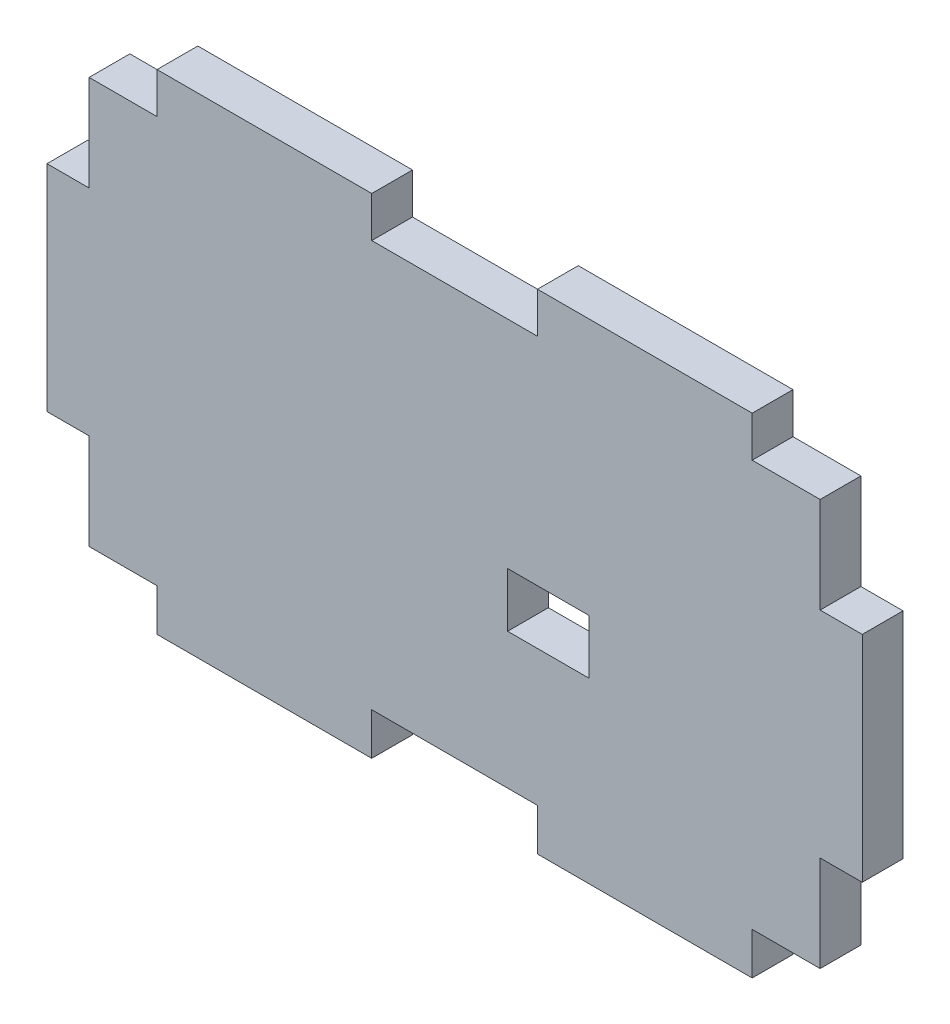
ISO-10303-21;
HEADER;
FILE_DESCRIPTION(('STEP AP214'),'2;1');
FILE_NAME('part.step','',(''),(''),'','','');
FILE_SCHEMA(('AUTOMOTIVE_DESIGN { 1 0 10303 214 1 1 1 1 }'));
ENDSEC;
DATA;
#1=APPLICATION_CONTEXT('core data for automotive mechanical design processes');
#2=APPLICATION_PROTOCOL_DEFINITION('international standard','automotive_design',2000,#1);
#3=PRODUCT_CONTEXT('',#1,'mechanical');
#4=PRODUCT('Part','Part','',(#3));
#5=PRODUCT_RELATED_PRODUCT_CATEGORY('part','',(#4));
#6=PRODUCT_DEFINITION_FORMATION('','',#4);
#7=PRODUCT_DEFINITION_CONTEXT('part definition',#1,'design');
#8=PRODUCT_DEFINITION('design','',#6,#7);
#9=PRODUCT_DEFINITION_SHAPE('','',#8);
#10=(LENGTH_UNIT() NAMED_UNIT(*) SI_UNIT(.MILLI.,.METRE.));
#11=(NAMED_UNIT(*) PLANE_ANGLE_UNIT() SI_UNIT($,.RADIAN.));
#12=(NAMED_UNIT(*) SI_UNIT($,.STERADIAN.) SOLID_ANGLE_UNIT());
#13=UNCERTAINTY_MEASURE_WITH_UNIT(LENGTH_MEASURE(1.E-05),#10,'distance_accuracy_value','');
#14=(GEOMETRIC_REPRESENTATION_CONTEXT(3) GLOBAL_UNCERTAINTY_ASSIGNED_CONTEXT((#13)) GLOBAL_UNIT_ASSIGNED_CONTEXT((#10,
#11,#12)) REPRESENTATION_CONTEXT('',''));
#15=CARTESIAN_POINT('',(0.,0.,0.));
#16=DIRECTION('',(0.,0.,1.));
#17=DIRECTION('',(1.,0.,0.));
#18=AXIS2_PLACEMENT_3D('',#15,#16,#17);
#19=CARTESIAN_POINT('',(0.,14.,3.));
#20=DIRECTION('',(0.,1.,0.));
#21=DIRECTION('',(-1.,0.,0.));
#22=AXIS2_PLACEMENT_3D('',#19,#20,#21);
#23=PLANE('',#22);
#24=DIRECTION('',(1.,0.,0.));
#25=VECTOR('',#24,1.);
#26=CARTESIAN_POINT('',(0.,14.,0.));
#27=LINE('',#26,#25);
#28=CARTESIAN_POINT('',(30.8,14.,0.));
#29=VERTEX_POINT('',#28);
#30=CARTESIAN_POINT('',(36.8,14.,0.));
#31=VERTEX_POINT('',#30);
#32=EDGE_CURVE('E361',#29,#31,#27,.T.);
#33=ORIENTED_EDGE('',*,*,#32,.T.);
#34=DIRECTION('',(0.,0.,-1.));
#35=VECTOR('',#34,1.);
#36=CARTESIAN_POINT('',(36.8,14.,3.));
#37=LINE('',#36,#35);
#38=CARTESIAN_POINT('',(36.8,14.,3.));
#39=VERTEX_POINT('',#38);
#40=EDGE_CURVE('E11',#39,#31,#37,.T.);
#41=ORIENTED_EDGE('',*,*,#40,.F.);
#42=DIRECTION('',(1.,0.,0.));
#43=VECTOR('',#42,1.);
#44=CARTESIAN_POINT('',(0.,14.,3.));
#45=LINE('',#44,#43);
#46=CARTESIAN_POINT('',(30.8,14.,3.));
#47=VERTEX_POINT('',#46);
#48=EDGE_CURVE('E260',#47,#39,#45,.T.);
#49=ORIENTED_EDGE('',*,*,#48,.F.);
#50=DIRECTION('',(0.,0.,-1.));
#51=VECTOR('',#50,1.);
#52=CARTESIAN_POINT('',(30.8,14.,3.));
#53=LINE('',#52,#51);
#54=EDGE_CURVE('E56',#47,#29,#53,.T.);
#55=ORIENTED_EDGE('',*,*,#54,.T.);
#56=EDGE_LOOP('',(#33,#41,#49,#55));
#57=FACE_BOUND('',#56,.T.);
#58=ADVANCED_FACE('F37',(#57),#23,.F.);
#59=CARTESIAN_POINT('',(36.8,0.,3.));
#60=DIRECTION('',(1.,0.,0.));
#61=DIRECTION('',(0.,1.,0.));
#62=AXIS2_PLACEMENT_3D('',#59,#60,#61);
#63=PLANE('',#62);
#64=DIRECTION('',(0.,-1.,0.));
#65=VECTOR('',#64,1.);
#66=CARTESIAN_POINT('',(36.8,0.,0.));
#67=LINE('',#66,#65);
#68=CARTESIAN_POINT('',(36.8,10.,0.));
#69=VERTEX_POINT('',#68);
#70=EDGE_CURVE('E266',#31,#69,#67,.T.);
#71=ORIENTED_EDGE('',*,*,#70,.T.);
#72=DIRECTION('',(0.,0.,-1.));
#73=VECTOR('',#72,1.);
#74=CARTESIAN_POINT('',(36.8,10.,3.));
#75=LINE('',#74,#73);
#76=CARTESIAN_POINT('',(36.8,10.,3.));
#77=VERTEX_POINT('',#76);
#78=EDGE_CURVE('E47',#77,#69,#75,.T.);
#79=ORIENTED_EDGE('',*,*,#78,.F.);
#80=DIRECTION('',(0.,-1.,0.));
#81=VECTOR('',#80,1.);
#82=CARTESIAN_POINT('',(36.8,0.,3.));
#83=LINE('',#82,#81);
#84=EDGE_CURVE('E254',#39,#77,#83,.T.);
#85=ORIENTED_EDGE('',*,*,#84,.F.);
#86=ORIENTED_EDGE('',*,*,#40,.T.);
#87=EDGE_LOOP('',(#71,#79,#85,#86));
#88=FACE_BOUND('',#87,.T.);
#89=ADVANCED_FACE('F265',(#88),#63,.F.);
#90=CARTESIAN_POINT('',(0.,10.,3.));
#91=DIRECTION('',(0.,1.,0.));
#92=DIRECTION('',(0.,0.,1.));
#93=AXIS2_PLACEMENT_3D('',#90,#91,#92);
#94=PLANE('',#93);
#95=DIRECTION('',(1.,0.,0.));
#96=VECTOR('',#95,1.);
#97=CARTESIAN_POINT('',(0.,10.,0.));
#98=LINE('',#97,#96);
#99=CARTESIAN_POINT('',(30.8,10.,0.));
#100=VERTEX_POINT('',#99);
#101=EDGE_CURVE('E364',#100,#69,#98,.T.);
#102=ORIENTED_EDGE('',*,*,#101,.F.);
#103=DIRECTION('',(0.,0.,-1.));
#104=VECTOR('',#103,1.);
#105=CARTESIAN_POINT('',(30.8,10.,3.));
#106=LINE('',#105,#104);
#107=CARTESIAN_POINT('',(30.8,10.,3.));
#108=VERTEX_POINT('',#107);
#109=EDGE_CURVE('E154',#108,#100,#106,.T.);
#110=ORIENTED_EDGE('',*,*,#109,.F.);
#111=DIRECTION('',(1.,0.,0.));
#112=VECTOR('',#111,1.);
#113=CARTESIAN_POINT('',(0.,10.,3.));
#114=LINE('',#113,#112);
#115=EDGE_CURVE('E259',#108,#77,#114,.T.);
#116=ORIENTED_EDGE('',*,*,#115,.T.);
#117=ORIENTED_EDGE('',*,*,#78,.T.);
#118=EDGE_LOOP('',(#102,#110,#116,#117));
#119=FACE_BOUND('',#118,.T.);
#120=ADVANCED_FACE('F270',(#119),#94,.T.);
#121=CARTESIAN_POINT('',(0.,0.,3.));
#122=DIRECTION('',(-1.,0.,0.));
#123=DIRECTION('',(0.,0.,1.));
#124=AXIS2_PLACEMENT_3D('',#121,#122,#123);
#125=PLANE('',#124);
#126=DIRECTION('',(0.,1.,0.));
#127=VECTOR('',#126,1.);
#128=CARTESIAN_POINT('',(0.,0.,0.));
#129=LINE('',#128,#127);
#130=CARTESIAN_POINT('',(0.,22.85,0.));
#131=VERTEX_POINT('',#130);
#132=CARTESIAN_POINT('',(0.,29.9,0.));
#133=VERTEX_POINT('',#132);
#134=EDGE_CURVE('E277',#131,#133,#129,.T.);
#135=ORIENTED_EDGE('',*,*,#134,.F.);
#136=DIRECTION('',(0.,0.,-1.));
#137=VECTOR('',#136,1.);
#138=CARTESIAN_POINT('',(0.,22.85,3.));
#139=LINE('',#138,#137);
#140=CARTESIAN_POINT('',(0.,22.85,3.));
#141=VERTEX_POINT('',#140);
#142=EDGE_CURVE('E41',#141,#131,#139,.T.);
#143=ORIENTED_EDGE('',*,*,#142,.F.);
#144=DIRECTION('',(0.,1.,0.));
#145=VECTOR('',#144,1.);
#146=CARTESIAN_POINT('',(0.,0.,3.));
#147=LINE('',#146,#145);
#148=CARTESIAN_POINT('',(0.,29.9,3.));
#149=VERTEX_POINT('',#148);
#150=EDGE_CURVE('E369',#141,#149,#147,.T.);
#151=ORIENTED_EDGE('',*,*,#150,.T.);
#152=DIRECTION('',(0.,0.,-1.));
#153=VECTOR('',#152,1.);
#154=CARTESIAN_POINT('',(0.,29.9,3.));
#155=LINE('',#154,#153);
#156=EDGE_CURVE('E273',#149,#133,#155,.T.);
#157=ORIENTED_EDGE('',*,*,#156,.T.);
#158=EDGE_LOOP('',(#135,#143,#151,#157));
#159=FACE_BOUND('',#158,.T.);
#160=ADVANCED_FACE('F39',(#159),#125,.T.);
#161=CARTESIAN_POINT('',(0.,22.85,3.));
#162=DIRECTION('',(0.,1.,0.));
#163=DIRECTION('',(0.,0.,1.));
#164=AXIS2_PLACEMENT_3D('',#161,#162,#163);
#165=PLANE('',#164);
#166=DIRECTION('',(1.,0.,0.));
#167=VECTOR('',#166,1.);
#168=CARTESIAN_POINT('',(0.,22.85,0.));
#169=LINE('',#168,#167);
#170=CARTESIAN_POINT('',(-3.1,22.85,0.));
#171=VERTEX_POINT('',#170);
#172=EDGE_CURVE('E280',#171,#131,#169,.T.);
#173=ORIENTED_EDGE('',*,*,#172,.F.);
#174=DIRECTION('',(0.,0.,-1.));
#175=VECTOR('',#174,1.);
#176=CARTESIAN_POINT('',(-3.1,22.85,3.));
#177=LINE('',#176,#175);
#178=CARTESIAN_POINT('',(-3.1,22.85,3.));
#179=VERTEX_POINT('',#178);
#180=EDGE_CURVE('E422',#179,#171,#177,.T.);
#181=ORIENTED_EDGE('',*,*,#180,.F.);
#182=DIRECTION('',(1.,0.,0.));
#183=VECTOR('',#182,1.);
#184=CARTESIAN_POINT('',(0.,22.85,3.));
#185=LINE('',#184,#183);
#186=EDGE_CURVE('E431',#179,#141,#185,.T.);
#187=ORIENTED_EDGE('',*,*,#186,.T.);
#188=ORIENTED_EDGE('',*,*,#142,.T.);
#189=EDGE_LOOP('',(#173,#181,#187,#188));
#190=FACE_BOUND('',#189,.T.);
#191=ADVANCED_FACE('F429',(#190),#165,.T.);
#192=CARTESIAN_POINT('',(-3.1,0.,3.));
#193=DIRECTION('',(-1.,0.,0.));
#194=DIRECTION('',(0.,0.,1.));
#195=AXIS2_PLACEMENT_3D('',#192,#193,#194);
#196=PLANE('',#195);
#197=DIRECTION('',(0.,1.,0.));
#198=VECTOR('',#197,1.);
#199=CARTESIAN_POINT('',(-3.1,0.,0.));
#200=LINE('',#199,#198);
#201=CARTESIAN_POINT('',(-3.1,7.05,0.));
#202=VERTEX_POINT('',#201);
#203=EDGE_CURVE('E283',#202,#171,#200,.T.);
#204=ORIENTED_EDGE('',*,*,#203,.F.);
#205=DIRECTION('',(0.,0.,-1.));
#206=VECTOR('',#205,1.);
#207=CARTESIAN_POINT('',(-3.1,7.05,3.));
#208=LINE('',#207,#206);
#209=CARTESIAN_POINT('',(-3.1,7.05,3.));
#210=VERTEX_POINT('',#209);
#211=EDGE_CURVE('E421',#210,#202,#208,.T.);
#212=ORIENTED_EDGE('',*,*,#211,.F.);
#213=DIRECTION('',(0.,1.,0.));
#214=VECTOR('',#213,1.);
#215=CARTESIAN_POINT('',(-3.1,0.,3.));
#216=LINE('',#215,#214);
#217=EDGE_CURVE('E439',#210,#179,#216,.T.);
#218=ORIENTED_EDGE('',*,*,#217,.T.);
#219=ORIENTED_EDGE('',*,*,#180,.T.);
#220=EDGE_LOOP('',(#204,#212,#218,#219));
#221=FACE_BOUND('',#220,.T.);
#222=ADVANCED_FACE('F437',(#221),#196,.T.);
#223=CARTESIAN_POINT('',(0.,7.05,3.));
#224=DIRECTION('',(0.,-1.,0.));
#225=DIRECTION('',(0.,0.,-1.));
#226=AXIS2_PLACEMENT_3D('',#223,#224,#225);
#227=PLANE('',#226);
#228=DIRECTION('',(-1.,0.,0.));
#229=VECTOR('',#228,1.);
#230=CARTESIAN_POINT('',(0.,7.05,0.));
#231=LINE('',#230,#229);
#232=CARTESIAN_POINT('',(0.,7.05,0.));
#233=VERTEX_POINT('',#232);
#234=EDGE_CURVE('E286',#233,#202,#231,.T.);
#235=ORIENTED_EDGE('',*,*,#234,.F.);
#236=DIRECTION('',(0.,0.,-1.));
#237=VECTOR('',#236,1.);
#238=CARTESIAN_POINT('',(0.,7.05,3.));
#239=LINE('',#238,#237);
#240=CARTESIAN_POINT('',(0.,7.05,3.));
#241=VERTEX_POINT('',#240);
#242=EDGE_CURVE('E419',#241,#233,#239,.T.);
#243=ORIENTED_EDGE('',*,*,#242,.F.);
#244=DIRECTION('',(-1.,0.,0.));
#245=VECTOR('',#244,1.);
#246=CARTESIAN_POINT('',(0.,7.05,3.));
#247=LINE('',#246,#245);
#248=EDGE_CURVE('E445',#241,#210,#247,.T.);
#249=ORIENTED_EDGE('',*,*,#248,.T.);
#250=ORIENTED_EDGE('',*,*,#211,.T.);
#251=EDGE_LOOP('',(#235,#243,#249,#250));
#252=FACE_BOUND('',#251,.T.);
#253=ADVANCED_FACE('F448',(#252),#227,.T.);
#254=CARTESIAN_POINT('',(0.,0.,3.));
#255=DIRECTION('',(-1.,0.,0.));
#256=DIRECTION('',(0.,0.,1.));
#257=AXIS2_PLACEMENT_3D('',#254,#255,#256);
#258=PLANE('',#257);
#259=DIRECTION('',(0.,1.,0.));
#260=VECTOR('',#259,1.);
#261=CARTESIAN_POINT('',(0.,0.,0.));
#262=LINE('',#261,#260);
#263=CARTESIAN_POINT('',(0.,0.,0.));
#264=VERTEX_POINT('',#263);
#265=EDGE_CURVE('E289',#264,#233,#262,.T.);
#266=ORIENTED_EDGE('',*,*,#265,.F.);
#267=DIRECTION('',(0.,0.,-1.));
#268=VECTOR('',#267,1.);
#269=CARTESIAN_POINT('',(0.,0.,3.));
#270=LINE('',#269,#268);
#271=CARTESIAN_POINT('',(0.,0.,3.));
#272=VERTEX_POINT('',#271);
#273=EDGE_CURVE('E417',#272,#264,#270,.T.);
#274=ORIENTED_EDGE('',*,*,#273,.F.);
#275=DIRECTION('',(0.,1.,0.));
#276=VECTOR('',#275,1.);
#277=CARTESIAN_POINT('',(0.,0.,3.));
#278=LINE('',#277,#276);
#279=EDGE_CURVE('E449',#272,#241,#278,.T.);
#280=ORIENTED_EDGE('',*,*,#279,.T.);
#281=ORIENTED_EDGE('',*,*,#242,.T.);
#282=EDGE_LOOP('',(#266,#274,#280,#281));
#283=FACE_BOUND('',#282,.T.);
#284=ADVANCED_FACE('F613',(#283),#258,.T.);
#285=CARTESIAN_POINT('',(0.,0.,3.));
#286=DIRECTION('',(0.,-1.,0.));
#287=DIRECTION('',(0.,0.,-1.));
#288=AXIS2_PLACEMENT_3D('',#285,#286,#287);
#289=PLANE('',#288);
#290=DIRECTION('',(-1.,0.,0.));
#291=VECTOR('',#290,1.);
#292=CARTESIAN_POINT('',(0.,0.,0.));
#293=LINE('',#292,#291);
#294=CARTESIAN_POINT('',(5.,0.,0.));
#295=VERTEX_POINT('',#294);
#296=EDGE_CURVE('E292',#295,#264,#293,.T.);
#297=ORIENTED_EDGE('',*,*,#296,.F.);
#298=DIRECTION('',(0.,0.,-1.));
#299=VECTOR('',#298,1.);
#300=CARTESIAN_POINT('',(5.,0.,3.));
#301=LINE('',#300,#299);
#302=CARTESIAN_POINT('',(5.,0.,3.));
#303=VERTEX_POINT('',#302);
#304=EDGE_CURVE('E415',#303,#295,#301,.T.);
#305=ORIENTED_EDGE('',*,*,#304,.F.);
#306=DIRECTION('',(-1.,0.,0.));
#307=VECTOR('',#306,1.);
#308=CARTESIAN_POINT('',(0.,0.,3.));
#309=LINE('',#308,#307);
#310=EDGE_CURVE('E451',#303,#272,#309,.T.);
#311=ORIENTED_EDGE('',*,*,#310,.T.);
#312=ORIENTED_EDGE('',*,*,#273,.T.);
#313=EDGE_LOOP('',(#297,#305,#311,#312));
#314=FACE_BOUND('',#313,.T.);
#315=ADVANCED_FACE('F610',(#314),#289,.T.);
#316=CARTESIAN_POINT('',(5.,0.,3.));
#317=DIRECTION('',(-1.,0.,0.));
#318=DIRECTION('',(0.,0.,1.));
#319=AXIS2_PLACEMENT_3D('',#316,#317,#318);
#320=PLANE('',#319);
#321=DIRECTION('',(0.,1.,0.));
#322=VECTOR('',#321,1.);
#323=CARTESIAN_POINT('',(5.,0.,0.));
#324=LINE('',#323,#322);
#325=CARTESIAN_POINT('',(5.,-3.1,0.));
#326=VERTEX_POINT('',#325);
#327=EDGE_CURVE('E295',#326,#295,#324,.T.);
#328=ORIENTED_EDGE('',*,*,#327,.F.);
#329=DIRECTION('',(0.,0.,-1.));
#330=VECTOR('',#329,1.);
#331=CARTESIAN_POINT('',(5.,-3.1,3.));
#332=LINE('',#331,#330);
#333=CARTESIAN_POINT('',(5.,-3.1,3.));
#334=VERTEX_POINT('',#333);
#335=EDGE_CURVE('E413',#334,#326,#332,.T.);
#336=ORIENTED_EDGE('',*,*,#335,.F.);
#337=DIRECTION('',(0.,1.,0.));
#338=VECTOR('',#337,1.);
#339=CARTESIAN_POINT('',(5.,0.,3.));
#340=LINE('',#339,#338);
#341=EDGE_CURVE('E457',#334,#303,#340,.T.);
#342=ORIENTED_EDGE('',*,*,#341,.T.);
#343=ORIENTED_EDGE('',*,*,#304,.T.);
#344=EDGE_LOOP('',(#328,#336,#342,#343));
#345=FACE_BOUND('',#344,.T.);
#346=ADVANCED_FACE('F604',(#345),#320,.T.);
#347=CARTESIAN_POINT('',(0.,-3.1,3.));
#348=DIRECTION('',(0.,1.,0.));
#349=DIRECTION('',(0.,0.,1.));
#350=AXIS2_PLACEMENT_3D('',#347,#348,#349);
#351=PLANE('',#350);
#352=DIRECTION('',(1.,0.,0.));
#353=VECTOR('',#352,1.);
#354=CARTESIAN_POINT('',(0.,-3.1,0.));
#355=LINE('',#354,#353);
#356=CARTESIAN_POINT('',(20.8,-3.1,0.));
#357=VERTEX_POINT('',#356);
#358=EDGE_CURVE('E298',#326,#357,#355,.T.);
#359=ORIENTED_EDGE('',*,*,#358,.T.);
#360=DIRECTION('',(0.,0.,-1.));
#361=VECTOR('',#360,1.);
#362=CARTESIAN_POINT('',(20.8,-3.1,3.));
#363=LINE('',#362,#361);
#364=CARTESIAN_POINT('',(20.8,-3.1,3.));
#365=VERTEX_POINT('',#364);
#366=EDGE_CURVE('E411',#365,#357,#363,.T.);
#367=ORIENTED_EDGE('',*,*,#366,.F.);
#368=DIRECTION('',(1.,0.,0.));
#369=VECTOR('',#368,1.);
#370=CARTESIAN_POINT('',(0.,-3.1,3.));
#371=LINE('',#370,#369);
#372=EDGE_CURVE('E460',#334,#365,#371,.T.);
#373=ORIENTED_EDGE('',*,*,#372,.F.);
#374=ORIENTED_EDGE('',*,*,#335,.T.);
#375=EDGE_LOOP('',(#359,#367,#373,#374));
#376=FACE_BOUND('',#375,.T.);
#377=ADVANCED_FACE('F614',(#376),#351,.F.);
#378=CARTESIAN_POINT('',(20.8,0.,3.));
#379=DIRECTION('',(1.,0.,0.));
#380=DIRECTION('',(0.,0.,-1.));
#381=AXIS2_PLACEMENT_3D('',#378,#379,#380);
#382=PLANE('',#381);
#383=DIRECTION('',(0.,-1.,0.));
#384=VECTOR('',#383,1.);
#385=CARTESIAN_POINT('',(20.8,0.,0.));
#386=LINE('',#385,#384);
#387=CARTESIAN_POINT('',(20.8,0.,0.));
#388=VERTEX_POINT('',#387);
#389=EDGE_CURVE('E301',#388,#357,#386,.T.);
#390=ORIENTED_EDGE('',*,*,#389,.F.);
#391=DIRECTION('',(0.,0.,-1.));
#392=VECTOR('',#391,1.);
#393=CARTESIAN_POINT('',(20.8,0.,3.));
#394=LINE('',#393,#392);
#395=CARTESIAN_POINT('',(20.8,0.,3.));
#396=VERTEX_POINT('',#395);
#397=EDGE_CURVE('E409',#396,#388,#394,.T.);
#398=ORIENTED_EDGE('',*,*,#397,.F.);
#399=DIRECTION('',(0.,-1.,0.));
#400=VECTOR('',#399,1.);
#401=CARTESIAN_POINT('',(20.8,0.,3.));
#402=LINE('',#401,#400);
#403=EDGE_CURVE('E462',#396,#365,#402,.T.);
#404=ORIENTED_EDGE('',*,*,#403,.T.);
#405=ORIENTED_EDGE('',*,*,#366,.T.);
#406=EDGE_LOOP('',(#390,#398,#404,#405));
#407=FACE_BOUND('',#406,.T.);
#408=ADVANCED_FACE('F598',(#407),#382,.T.);
#409=CARTESIAN_POINT('',(0.,0.,3.));
#410=DIRECTION('',(0.,-1.,0.));
#411=DIRECTION('',(1.,0.,0.));
#412=AXIS2_PLACEMENT_3D('',#409,#410,#411);
#413=PLANE('',#412);
#414=DIRECTION('',(-1.,0.,0.));
#415=VECTOR('',#414,1.);
#416=CARTESIAN_POINT('',(0.,0.,0.));
#417=LINE('',#416,#415);
#418=CARTESIAN_POINT('',(33.,0.,0.));
#419=VERTEX_POINT('',#418);
#420=EDGE_CURVE('E304',#419,#388,#417,.T.);
#421=ORIENTED_EDGE('',*,*,#420,.F.);
#422=DIRECTION('',(0.,0.,-1.));
#423=VECTOR('',#422,1.);
#424=CARTESIAN_POINT('',(33.,0.,3.));
#425=LINE('',#424,#423);
#426=CARTESIAN_POINT('',(33.,0.,3.));
#427=VERTEX_POINT('',#426);
#428=EDGE_CURVE('E407',#427,#419,#425,.T.);
#429=ORIENTED_EDGE('',*,*,#428,.F.);
#430=DIRECTION('',(-1.,0.,0.));
#431=VECTOR('',#430,1.);
#432=CARTESIAN_POINT('',(0.,0.,3.));
#433=LINE('',#432,#431);
#434=EDGE_CURVE('E465',#427,#396,#433,.T.);
#435=ORIENTED_EDGE('',*,*,#434,.T.);
#436=ORIENTED_EDGE('',*,*,#397,.T.);
#437=EDGE_LOOP('',(#421,#429,#435,#436));
#438=FACE_BOUND('',#437,.T.);
#439=ADVANCED_FACE('F594',(#438),#413,.T.);
#440=CARTESIAN_POINT('',(33.,0.,3.));
#441=DIRECTION('',(-1.,0.,0.));
#442=DIRECTION('',(0.,0.,1.));
#443=AXIS2_PLACEMENT_3D('',#440,#441,#442);
#444=PLANE('',#443);
#445=DIRECTION('',(0.,1.,0.));
#446=VECTOR('',#445,1.);
#447=CARTESIAN_POINT('',(33.,0.,0.));
#448=LINE('',#447,#446);
#449=CARTESIAN_POINT('',(33.,-3.1,0.));
#450=VERTEX_POINT('',#449);
#451=EDGE_CURVE('E307',#450,#419,#448,.T.);
#452=ORIENTED_EDGE('',*,*,#451,.F.);
#453=DIRECTION('',(0.,0.,-1.));
#454=VECTOR('',#453,1.);
#455=CARTESIAN_POINT('',(33.,-3.1,3.));
#456=LINE('',#455,#454);
#457=CARTESIAN_POINT('',(33.,-3.1,3.));
#458=VERTEX_POINT('',#457);
#459=EDGE_CURVE('E405',#458,#450,#456,.T.);
#460=ORIENTED_EDGE('',*,*,#459,.F.);
#461=DIRECTION('',(0.,1.,0.));
#462=VECTOR('',#461,1.);
#463=CARTESIAN_POINT('',(33.,0.,3.));
#464=LINE('',#463,#462);
#465=EDGE_CURVE('E468',#458,#427,#464,.T.);
#466=ORIENTED_EDGE('',*,*,#465,.T.);
#467=ORIENTED_EDGE('',*,*,#428,.T.);
#468=EDGE_LOOP('',(#452,#460,#466,#467));
#469=FACE_BOUND('',#468,.T.);
#470=ADVANCED_FACE('F590',(#469),#444,.T.);
#471=CARTESIAN_POINT('',(0.,-3.1,3.));
#472=DIRECTION('',(0.,-1.,0.));
#473=DIRECTION('',(0.,0.,-1.));
#474=AXIS2_PLACEMENT_3D('',#471,#472,#473);
#475=PLANE('',#474);
#476=DIRECTION('',(-1.,0.,0.));
#477=VECTOR('',#476,1.);
#478=CARTESIAN_POINT('',(0.,-3.1,0.));
#479=LINE('',#478,#477);
#480=CARTESIAN_POINT('',(48.8,-3.1,0.));
#481=VERTEX_POINT('',#480);
#482=EDGE_CURVE('E310',#481,#450,#479,.T.);
#483=ORIENTED_EDGE('',*,*,#482,.F.);
#484=DIRECTION('',(0.,0.,-1.));
#485=VECTOR('',#484,1.);
#486=CARTESIAN_POINT('',(48.8,-3.1,3.));
#487=LINE('',#486,#485);
#488=CARTESIAN_POINT('',(48.8,-3.1,3.));
#489=VERTEX_POINT('',#488);
#490=EDGE_CURVE('E403',#489,#481,#487,.T.);
#491=ORIENTED_EDGE('',*,*,#490,.F.);
#492=DIRECTION('',(-1.,0.,0.));
#493=VECTOR('',#492,1.);
#494=CARTESIAN_POINT('',(0.,-3.1,3.));
#495=LINE('',#494,#493);
#496=EDGE_CURVE('E471',#489,#458,#495,.T.);
#497=ORIENTED_EDGE('',*,*,#496,.T.);
#498=ORIENTED_EDGE('',*,*,#459,.T.);
#499=EDGE_LOOP('',(#483,#491,#497,#498));
#500=FACE_BOUND('',#499,.T.);
#501=ADVANCED_FACE('F586',(#500),#475,.T.);
#502=CARTESIAN_POINT('',(48.8,0.,3.));
#503=DIRECTION('',(1.,0.,0.));
#504=DIRECTION('',(0.,0.,-1.));
#505=AXIS2_PLACEMENT_3D('',#502,#503,#504);
#506=PLANE('',#505);
#507=DIRECTION('',(0.,-1.,0.));
#508=VECTOR('',#507,1.);
#509=CARTESIAN_POINT('',(48.8,0.,0.));
#510=LINE('',#509,#508);
#511=CARTESIAN_POINT('',(48.8,0.,0.));
#512=VERTEX_POINT('',#511);
#513=EDGE_CURVE('E313',#512,#481,#510,.T.);
#514=ORIENTED_EDGE('',*,*,#513,.F.);
#515=DIRECTION('',(0.,0.,-1.));
#516=VECTOR('',#515,1.);
#517=CARTESIAN_POINT('',(48.8,0.,3.));
#518=LINE('',#517,#516);
#519=CARTESIAN_POINT('',(48.8,0.,3.));
#520=VERTEX_POINT('',#519);
#521=EDGE_CURVE('E401',#520,#512,#518,.T.);
#522=ORIENTED_EDGE('',*,*,#521,.F.);
#523=DIRECTION('',(0.,-1.,0.));
#524=VECTOR('',#523,1.);
#525=CARTESIAN_POINT('',(48.8,0.,3.));
#526=LINE('',#525,#524);
#527=EDGE_CURVE('E474',#520,#489,#526,.T.);
#528=ORIENTED_EDGE('',*,*,#527,.T.);
#529=ORIENTED_EDGE('',*,*,#490,.T.);
#530=EDGE_LOOP('',(#514,#522,#528,#529));
#531=FACE_BOUND('',#530,.T.);
#532=ADVANCED_FACE('F582',(#531),#506,.T.);
#533=CARTESIAN_POINT('',(0.,0.,3.));
#534=DIRECTION('',(0.,-1.,0.));
#535=DIRECTION('',(0.,0.,-1.));
#536=AXIS2_PLACEMENT_3D('',#533,#534,#535);
#537=PLANE('',#536);
#538=DIRECTION('',(-1.,0.,0.));
#539=VECTOR('',#538,1.);
#540=CARTESIAN_POINT('',(0.,0.,0.));
#541=LINE('',#540,#539);
#542=CARTESIAN_POINT('',(53.8,0.,0.));
#543=VERTEX_POINT('',#542);
#544=EDGE_CURVE('E316',#543,#512,#541,.T.);
#545=ORIENTED_EDGE('',*,*,#544,.F.);
#546=DIRECTION('',(0.,0.,-1.));
#547=VECTOR('',#546,1.);
#548=CARTESIAN_POINT('',(53.8,0.,3.));
#549=LINE('',#548,#547);
#550=CARTESIAN_POINT('',(53.8,0.,3.));
#551=VERTEX_POINT('',#550);
#552=EDGE_CURVE('E399',#551,#543,#549,.T.);
#553=ORIENTED_EDGE('',*,*,#552,.F.);
#554=DIRECTION('',(-1.,0.,0.));
#555=VECTOR('',#554,1.);
#556=CARTESIAN_POINT('',(0.,0.,3.));
#557=LINE('',#556,#555);
#558=EDGE_CURVE('E477',#551,#520,#557,.T.);
#559=ORIENTED_EDGE('',*,*,#558,.T.);
#560=ORIENTED_EDGE('',*,*,#521,.T.);
#561=EDGE_LOOP('',(#545,#553,#559,#560));
#562=FACE_BOUND('',#561,.T.);
#563=ADVANCED_FACE('F578',(#562),#537,.T.);
#564=CARTESIAN_POINT('',(53.8,0.,3.));
#565=DIRECTION('',(1.,0.,0.));
#566=DIRECTION('',(0.,0.,-1.));
#567=AXIS2_PLACEMENT_3D('',#564,#565,#566);
#568=PLANE('',#567);
#569=DIRECTION('',(0.,-1.,0.));
#570=VECTOR('',#569,1.);
#571=CARTESIAN_POINT('',(53.8,0.,0.));
#572=LINE('',#571,#570);
#573=CARTESIAN_POINT('',(53.8,7.05,0.));
#574=VERTEX_POINT('',#573);
#575=EDGE_CURVE('E319',#574,#543,#572,.T.);
#576=ORIENTED_EDGE('',*,*,#575,.F.);
#577=DIRECTION('',(0.,0.,-1.));
#578=VECTOR('',#577,1.);
#579=CARTESIAN_POINT('',(53.8,7.05,3.));
#580=LINE('',#579,#578);
#581=CARTESIAN_POINT('',(53.8,7.05,3.));
#582=VERTEX_POINT('',#581);
#583=EDGE_CURVE('E397',#582,#574,#580,.T.);
#584=ORIENTED_EDGE('',*,*,#583,.F.);
#585=DIRECTION('',(0.,-1.,0.));
#586=VECTOR('',#585,1.);
#587=CARTESIAN_POINT('',(53.8,0.,3.));
#588=LINE('',#587,#586);
#589=EDGE_CURVE('E480',#582,#551,#588,.T.);
#590=ORIENTED_EDGE('',*,*,#589,.T.);
#591=ORIENTED_EDGE('',*,*,#552,.T.);
#592=EDGE_LOOP('',(#576,#584,#590,#591));
#593=FACE_BOUND('',#592,.T.);
#594=ADVANCED_FACE('F574',(#593),#568,.T.);
#595=CARTESIAN_POINT('',(0.,7.05,3.));
#596=DIRECTION('',(0.,-1.,0.));
#597=DIRECTION('',(0.,0.,-1.));
#598=AXIS2_PLACEMENT_3D('',#595,#596,#597);
#599=PLANE('',#598);
#600=DIRECTION('',(-1.,0.,0.));
#601=VECTOR('',#600,1.);
#602=CARTESIAN_POINT('',(0.,7.05,0.));
#603=LINE('',#602,#601);
#604=CARTESIAN_POINT('',(56.9,7.05,0.));
#605=VERTEX_POINT('',#604);
#606=EDGE_CURVE('E322',#605,#574,#603,.T.);
#607=ORIENTED_EDGE('',*,*,#606,.F.);
#608=DIRECTION('',(0.,0.,-1.));
#609=VECTOR('',#608,1.);
#610=CARTESIAN_POINT('',(56.9,7.05,3.));
#611=LINE('',#610,#609);
#612=CARTESIAN_POINT('',(56.9,7.05,3.));
#613=VERTEX_POINT('',#612);
#614=EDGE_CURVE('E395',#613,#605,#611,.T.);
#615=ORIENTED_EDGE('',*,*,#614,.F.);
#616=DIRECTION('',(-1.,0.,0.));
#617=VECTOR('',#616,1.);
#618=CARTESIAN_POINT('',(0.,7.05,3.));
#619=LINE('',#618,#617);
#620=EDGE_CURVE('E483',#613,#582,#619,.T.);
#621=ORIENTED_EDGE('',*,*,#620,.T.);
#622=ORIENTED_EDGE('',*,*,#583,.T.);
#623=EDGE_LOOP('',(#607,#615,#621,#622));
#624=FACE_BOUND('',#623,.T.);
#625=ADVANCED_FACE('F568',(#624),#599,.T.);
#626=CARTESIAN_POINT('',(56.9,0.,3.));
#627=DIRECTION('',(-1.,0.,0.));
#628=DIRECTION('',(0.,0.,1.));
#629=AXIS2_PLACEMENT_3D('',#626,#627,#628);
#630=PLANE('',#629);
#631=DIRECTION('',(0.,1.,0.));
#632=VECTOR('',#631,1.);
#633=CARTESIAN_POINT('',(56.9,0.,0.));
#634=LINE('',#633,#632);
#635=CARTESIAN_POINT('',(56.9,22.85,0.));
#636=VERTEX_POINT('',#635);
#637=EDGE_CURVE('E325',#605,#636,#634,.T.);
#638=ORIENTED_EDGE('',*,*,#637,.T.);
#639=DIRECTION('',(0.,0.,-1.));
#640=VECTOR('',#639,1.);
#641=CARTESIAN_POINT('',(56.9,22.85,3.));
#642=LINE('',#641,#640);
#643=CARTESIAN_POINT('',(56.9,22.85,3.));
#644=VERTEX_POINT('',#643);
#645=EDGE_CURVE('E393',#644,#636,#642,.T.);
#646=ORIENTED_EDGE('',*,*,#645,.F.);
#647=DIRECTION('',(0.,1.,0.));
#648=VECTOR('',#647,1.);
#649=CARTESIAN_POINT('',(56.9,0.,3.));
#650=LINE('',#649,#648);
#651=EDGE_CURVE('E486',#613,#644,#650,.T.);
#652=ORIENTED_EDGE('',*,*,#651,.F.);
#653=ORIENTED_EDGE('',*,*,#614,.T.);
#654=EDGE_LOOP('',(#638,#646,#652,#653));
#655=FACE_BOUND('',#654,.T.);
#656=ADVANCED_FACE('F654',(#655),#630,.F.);
#657=CARTESIAN_POINT('',(0.,22.85,3.));
#658=DIRECTION('',(0.,1.,0.));
#659=DIRECTION('',(0.,0.,1.));
#660=AXIS2_PLACEMENT_3D('',#657,#658,#659);
#661=PLANE('',#660);
#662=DIRECTION('',(1.,0.,0.));
#663=VECTOR('',#662,1.);
#664=CARTESIAN_POINT('',(0.,22.85,0.));
#665=LINE('',#664,#663);
#666=CARTESIAN_POINT('',(53.8,22.85,0.));
#667=VERTEX_POINT('',#666);
#668=EDGE_CURVE('E328',#667,#636,#665,.T.);
#669=ORIENTED_EDGE('',*,*,#668,.F.);
#670=DIRECTION('',(0.,0.,-1.));
#671=VECTOR('',#670,1.);
#672=CARTESIAN_POINT('',(53.8,22.85,3.));
#673=LINE('',#672,#671);
#674=CARTESIAN_POINT('',(53.8,22.85,3.));
#675=VERTEX_POINT('',#674);
#676=EDGE_CURVE('E391',#675,#667,#673,.T.);
#677=ORIENTED_EDGE('',*,*,#676,.F.);
#678=DIRECTION('',(1.,0.,0.));
#679=VECTOR('',#678,1.);
#680=CARTESIAN_POINT('',(0.,22.85,3.));
#681=LINE('',#680,#679);
#682=EDGE_CURVE('E488',#675,#644,#681,.T.);
#683=ORIENTED_EDGE('',*,*,#682,.T.);
#684=ORIENTED_EDGE('',*,*,#645,.T.);
#685=EDGE_LOOP('',(#669,#677,#683,#684));
#686=FACE_BOUND('',#685,.T.);
#687=ADVANCED_FACE('F562',(#686),#661,.T.);
#688=CARTESIAN_POINT('',(53.8,0.,3.));
#689=DIRECTION('',(1.,0.,0.));
#690=DIRECTION('',(0.,0.,-1.));
#691=AXIS2_PLACEMENT_3D('',#688,#689,#690);
#692=PLANE('',#691);
#693=DIRECTION('',(0.,-1.,0.));
#694=VECTOR('',#693,1.);
#695=CARTESIAN_POINT('',(53.8,0.,0.));
#696=LINE('',#695,#694);
#697=CARTESIAN_POINT('',(53.8,29.9,0.));
#698=VERTEX_POINT('',#697);
#699=EDGE_CURVE('E331',#698,#667,#696,.T.);
#700=ORIENTED_EDGE('',*,*,#699,.F.);
#701=DIRECTION('',(0.,0.,-1.));
#702=VECTOR('',#701,1.);
#703=CARTESIAN_POINT('',(53.8,29.9,3.));
#704=LINE('',#703,#702);
#705=CARTESIAN_POINT('',(53.8,29.9,3.));
#706=VERTEX_POINT('',#705);
#707=EDGE_CURVE('E389',#706,#698,#704,.T.);
#708=ORIENTED_EDGE('',*,*,#707,.F.);
#709=DIRECTION('',(0.,-1.,0.));
#710=VECTOR('',#709,1.);
#711=CARTESIAN_POINT('',(53.8,0.,3.));
#712=LINE('',#711,#710);
#713=EDGE_CURVE('E491',#706,#675,#712,.T.);
#714=ORIENTED_EDGE('',*,*,#713,.T.);
#715=ORIENTED_EDGE('',*,*,#676,.T.);
#716=EDGE_LOOP('',(#700,#708,#714,#715));
#717=FACE_BOUND('',#716,.T.);
#718=ADVANCED_FACE('F558',(#717),#692,.T.);
#719=CARTESIAN_POINT('',(0.,29.9,3.));
#720=DIRECTION('',(0.,1.,0.));
#721=DIRECTION('',(0.,0.,1.));
#722=AXIS2_PLACEMENT_3D('',#719,#720,#721);
#723=PLANE('',#722);
#724=DIRECTION('',(1.,0.,0.));
#725=VECTOR('',#724,1.);
#726=CARTESIAN_POINT('',(0.,29.9,0.));
#727=LINE('',#726,#725);
#728=CARTESIAN_POINT('',(48.8,29.9,0.));
#729=VERTEX_POINT('',#728);
#730=EDGE_CURVE('E334',#729,#698,#727,.T.);
#731=ORIENTED_EDGE('',*,*,#730,.F.);
#732=DIRECTION('',(0.,0.,-1.));
#733=VECTOR('',#732,1.);
#734=CARTESIAN_POINT('',(48.8,29.9,3.));
#735=LINE('',#734,#733);
#736=CARTESIAN_POINT('',(48.8,29.9,3.));
#737=VERTEX_POINT('',#736);
#738=EDGE_CURVE('E387',#737,#729,#735,.T.);
#739=ORIENTED_EDGE('',*,*,#738,.F.);
#740=DIRECTION('',(1.,0.,0.));
#741=VECTOR('',#740,1.);
#742=CARTESIAN_POINT('',(0.,29.9,3.));
#743=LINE('',#742,#741);
#744=EDGE_CURVE('E494',#737,#706,#743,.T.);
#745=ORIENTED_EDGE('',*,*,#744,.T.);
#746=ORIENTED_EDGE('',*,*,#707,.T.);
#747=EDGE_LOOP('',(#731,#739,#745,#746));
#748=FACE_BOUND('',#747,.T.);
#749=ADVANCED_FACE('F554',(#748),#723,.T.);
#750=CARTESIAN_POINT('',(48.8,0.,3.));
#751=DIRECTION('',(1.,0.,0.));
#752=DIRECTION('',(0.,0.,-1.));
#753=AXIS2_PLACEMENT_3D('',#750,#751,#752);
#754=PLANE('',#753);
#755=DIRECTION('',(0.,-1.,0.));
#756=VECTOR('',#755,1.);
#757=CARTESIAN_POINT('',(48.8,0.,0.));
#758=LINE('',#757,#756);
#759=CARTESIAN_POINT('',(48.8,32.9,0.));
#760=VERTEX_POINT('',#759);
#761=EDGE_CURVE('E337',#760,#729,#758,.T.);
#762=ORIENTED_EDGE('',*,*,#761,.F.);
#763=DIRECTION('',(0.,0.,-1.));
#764=VECTOR('',#763,1.);
#765=CARTESIAN_POINT('',(48.8,32.9,3.));
#766=LINE('',#765,#764);
#767=CARTESIAN_POINT('',(48.8,32.9,3.));
#768=VERTEX_POINT('',#767);
#769=EDGE_CURVE('E385',#768,#760,#766,.T.);
#770=ORIENTED_EDGE('',*,*,#769,.F.);
#771=DIRECTION('',(0.,-1.,0.));
#772=VECTOR('',#771,1.);
#773=CARTESIAN_POINT('',(48.8,0.,3.));
#774=LINE('',#773,#772);
#775=EDGE_CURVE('E497',#768,#737,#774,.T.);
#776=ORIENTED_EDGE('',*,*,#775,.T.);
#777=ORIENTED_EDGE('',*,*,#738,.T.);
#778=EDGE_LOOP('',(#762,#770,#776,#777));
#779=FACE_BOUND('',#778,.T.);
#780=ADVANCED_FACE('F550',(#779),#754,.T.);
#781=CARTESIAN_POINT('',(0.,32.9,3.));
#782=DIRECTION('',(0.,1.,0.));
#783=DIRECTION('',(0.,0.,1.));
#784=AXIS2_PLACEMENT_3D('',#781,#782,#783);
#785=PLANE('',#784);
#786=DIRECTION('',(1.,0.,0.));
#787=VECTOR('',#786,1.);
#788=CARTESIAN_POINT('',(0.,32.9,0.));
#789=LINE('',#788,#787);
#790=CARTESIAN_POINT('',(33.,32.9,0.));
#791=VERTEX_POINT('',#790);
#792=EDGE_CURVE('E340',#791,#760,#789,.T.);
#793=ORIENTED_EDGE('',*,*,#792,.F.);
#794=DIRECTION('',(0.,0.,-1.));
#795=VECTOR('',#794,1.);
#796=CARTESIAN_POINT('',(33.,32.9,3.));
#797=LINE('',#796,#795);
#798=CARTESIAN_POINT('',(33.,32.9,3.));
#799=VERTEX_POINT('',#798);
#800=EDGE_CURVE('E383',#799,#791,#797,.T.);
#801=ORIENTED_EDGE('',*,*,#800,.F.);
#802=DIRECTION('',(1.,0.,0.));
#803=VECTOR('',#802,1.);
#804=CARTESIAN_POINT('',(0.,32.9,3.));
#805=LINE('',#804,#803);
#806=EDGE_CURVE('E500',#799,#768,#805,.T.);
#807=ORIENTED_EDGE('',*,*,#806,.T.);
#808=ORIENTED_EDGE('',*,*,#769,.T.);
#809=EDGE_LOOP('',(#793,#801,#807,#808));
#810=FACE_BOUND('',#809,.T.);
#811=ADVANCED_FACE('F546',(#810),#785,.T.);
#812=CARTESIAN_POINT('',(33.,0.,3.));
#813=DIRECTION('',(-1.,0.,0.));
#814=DIRECTION('',(0.,0.,1.));
#815=AXIS2_PLACEMENT_3D('',#812,#813,#814);
#816=PLANE('',#815);
#817=DIRECTION('',(0.,1.,0.));
#818=VECTOR('',#817,1.);
#819=CARTESIAN_POINT('',(33.,0.,0.));
#820=LINE('',#819,#818);
#821=CARTESIAN_POINT('',(33.,29.9,0.));
#822=VERTEX_POINT('',#821);
#823=EDGE_CURVE('E343',#822,#791,#820,.T.);
#824=ORIENTED_EDGE('',*,*,#823,.F.);
#825=DIRECTION('',(0.,0.,-1.));
#826=VECTOR('',#825,1.);
#827=CARTESIAN_POINT('',(33.,29.9,3.));
#828=LINE('',#827,#826);
#829=CARTESIAN_POINT('',(33.,29.9,3.));
#830=VERTEX_POINT('',#829);
#831=EDGE_CURVE('E381',#830,#822,#828,.T.);
#832=ORIENTED_EDGE('',*,*,#831,.F.);
#833=DIRECTION('',(0.,1.,0.));
#834=VECTOR('',#833,1.);
#835=CARTESIAN_POINT('',(33.,0.,3.));
#836=LINE('',#835,#834);
#837=EDGE_CURVE('E503',#830,#799,#836,.T.);
#838=ORIENTED_EDGE('',*,*,#837,.T.);
#839=ORIENTED_EDGE('',*,*,#800,.T.);
#840=EDGE_LOOP('',(#824,#832,#838,#839));
#841=FACE_BOUND('',#840,.T.);
#842=ADVANCED_FACE('F542',(#841),#816,.T.);
#843=CARTESIAN_POINT('',(0.,29.9,3.));
#844=DIRECTION('',(0.,1.,0.));
#845=DIRECTION('',(0.,0.,1.));
#846=AXIS2_PLACEMENT_3D('',#843,#844,#845);
#847=PLANE('',#846);
#848=DIRECTION('',(1.,0.,0.));
#849=VECTOR('',#848,1.);
#850=CARTESIAN_POINT('',(0.,29.9,0.));
#851=LINE('',#850,#849);
#852=CARTESIAN_POINT('',(20.8,29.9,0.));
#853=VERTEX_POINT('',#852);
#854=EDGE_CURVE('E346',#853,#822,#851,.T.);
#855=ORIENTED_EDGE('',*,*,#854,.F.);
#856=DIRECTION('',(0.,0.,-1.));
#857=VECTOR('',#856,1.);
#858=CARTESIAN_POINT('',(20.8,29.9,3.));
#859=LINE('',#858,#857);
#860=CARTESIAN_POINT('',(20.8,29.9,3.));
#861=VERTEX_POINT('',#860);
#862=EDGE_CURVE('E379',#861,#853,#859,.T.);
#863=ORIENTED_EDGE('',*,*,#862,.F.);
#864=DIRECTION('',(1.,0.,0.));
#865=VECTOR('',#864,1.);
#866=CARTESIAN_POINT('',(0.,29.9,3.));
#867=LINE('',#866,#865);
#868=EDGE_CURVE('E506',#861,#830,#867,.T.);
#869=ORIENTED_EDGE('',*,*,#868,.T.);
#870=ORIENTED_EDGE('',*,*,#831,.T.);
#871=EDGE_LOOP('',(#855,#863,#869,#870));
#872=FACE_BOUND('',#871,.T.);
#873=ADVANCED_FACE('F538',(#872),#847,.T.);
#874=CARTESIAN_POINT('',(20.8,0.,3.));
#875=DIRECTION('',(1.,0.,0.));
#876=DIRECTION('',(0.,0.,-1.));
#877=AXIS2_PLACEMENT_3D('',#874,#875,#876);
#878=PLANE('',#877);
#879=DIRECTION('',(0.,-1.,0.));
#880=VECTOR('',#879,1.);
#881=CARTESIAN_POINT('',(20.8,0.,0.));
#882=LINE('',#881,#880);
#883=CARTESIAN_POINT('',(20.8,32.9,0.));
#884=VERTEX_POINT('',#883);
#885=EDGE_CURVE('E349',#884,#853,#882,.T.);
#886=ORIENTED_EDGE('',*,*,#885,.F.);
#887=DIRECTION('',(0.,0.,-1.));
#888=VECTOR('',#887,1.);
#889=CARTESIAN_POINT('',(20.8,32.9,3.));
#890=LINE('',#889,#888);
#891=CARTESIAN_POINT('',(20.8,32.9,3.));
#892=VERTEX_POINT('',#891);
#893=EDGE_CURVE('E377',#892,#884,#890,.T.);
#894=ORIENTED_EDGE('',*,*,#893,.F.);
#895=DIRECTION('',(0.,-1.,0.));
#896=VECTOR('',#895,1.);
#897=CARTESIAN_POINT('',(20.8,0.,3.));
#898=LINE('',#897,#896);
#899=EDGE_CURVE('E509',#892,#861,#898,.T.);
#900=ORIENTED_EDGE('',*,*,#899,.T.);
#901=ORIENTED_EDGE('',*,*,#862,.T.);
#902=EDGE_LOOP('',(#886,#894,#900,#901));
#903=FACE_BOUND('',#902,.T.);
#904=ADVANCED_FACE('F534',(#903),#878,.T.);
#905=CARTESIAN_POINT('',(0.,32.9,3.));
#906=DIRECTION('',(0.,1.,0.));
#907=DIRECTION('',(0.,0.,1.));
#908=AXIS2_PLACEMENT_3D('',#905,#906,#907);
#909=PLANE('',#908);
#910=DIRECTION('',(1.,0.,0.));
#911=VECTOR('',#910,1.);
#912=CARTESIAN_POINT('',(0.,32.9,0.));
#913=LINE('',#912,#911);
#914=CARTESIAN_POINT('',(5.,32.9,0.));
#915=VERTEX_POINT('',#914);
#916=EDGE_CURVE('E352',#915,#884,#913,.T.);
#917=ORIENTED_EDGE('',*,*,#916,.F.);
#918=DIRECTION('',(0.,0.,-1.));
#919=VECTOR('',#918,1.);
#920=CARTESIAN_POINT('',(5.,32.9,3.));
#921=LINE('',#920,#919);
#922=CARTESIAN_POINT('',(5.,32.9,3.));
#923=VERTEX_POINT('',#922);
#924=EDGE_CURVE('E375',#923,#915,#921,.T.);
#925=ORIENTED_EDGE('',*,*,#924,.F.);
#926=DIRECTION('',(1.,0.,0.));
#927=VECTOR('',#926,1.);
#928=CARTESIAN_POINT('',(0.,32.9,3.));
#929=LINE('',#928,#927);
#930=EDGE_CURVE('E512',#923,#892,#929,.T.);
#931=ORIENTED_EDGE('',*,*,#930,.T.);
#932=ORIENTED_EDGE('',*,*,#893,.T.);
#933=EDGE_LOOP('',(#917,#925,#931,#932));
#934=FACE_BOUND('',#933,.T.);
#935=ADVANCED_FACE('F532',(#934),#909,.T.);
#936=CARTESIAN_POINT('',(5.,0.,3.));
#937=DIRECTION('',(-1.,0.,0.));
#938=DIRECTION('',(0.,0.,1.));
#939=AXIS2_PLACEMENT_3D('',#936,#937,#938);
#940=PLANE('',#939);
#941=DIRECTION('',(0.,1.,0.));
#942=VECTOR('',#941,1.);
#943=CARTESIAN_POINT('',(5.,0.,0.));
#944=LINE('',#943,#942);
#945=CARTESIAN_POINT('',(5.,29.9,0.));
#946=VERTEX_POINT('',#945);
#947=EDGE_CURVE('E355',#946,#915,#944,.T.);
#948=ORIENTED_EDGE('',*,*,#947,.F.);
#949=DIRECTION('',(0.,0.,-1.));
#950=VECTOR('',#949,1.);
#951=CARTESIAN_POINT('',(5.,29.9,3.));
#952=LINE('',#951,#950);
#953=CARTESIAN_POINT('',(5.,29.9,3.));
#954=VERTEX_POINT('',#953);
#955=EDGE_CURVE('E373',#954,#946,#952,.T.);
#956=ORIENTED_EDGE('',*,*,#955,.F.);
#957=DIRECTION('',(0.,1.,0.));
#958=VECTOR('',#957,1.);
#959=CARTESIAN_POINT('',(5.,0.,3.));
#960=LINE('',#959,#958);
#961=EDGE_CURVE('E515',#954,#923,#960,.T.);
#962=ORIENTED_EDGE('',*,*,#961,.T.);
#963=ORIENTED_EDGE('',*,*,#924,.T.);
#964=EDGE_LOOP('',(#948,#956,#962,#963));
#965=FACE_BOUND('',#964,.T.);
#966=ADVANCED_FACE('F528',(#965),#940,.T.);
#967=CARTESIAN_POINT('',(0.,29.9,3.));
#968=DIRECTION('',(0.,1.,0.));
#969=DIRECTION('',(0.,0.,1.));
#970=AXIS2_PLACEMENT_3D('',#967,#968,#969);
#971=PLANE('',#970);
#972=DIRECTION('',(1.,0.,0.));
#973=VECTOR('',#972,1.);
#974=CARTESIAN_POINT('',(0.,29.9,0.));
#975=LINE('',#974,#973);
#976=EDGE_CURVE('E358',#133,#946,#975,.T.);
#977=ORIENTED_EDGE('',*,*,#976,.F.);
#978=ORIENTED_EDGE('',*,*,#156,.F.);
#979=DIRECTION('',(1.,0.,0.));
#980=VECTOR('',#979,1.);
#981=CARTESIAN_POINT('',(0.,29.9,3.));
#982=LINE('',#981,#980);
#983=EDGE_CURVE('E518',#149,#954,#982,.T.);
#984=ORIENTED_EDGE('',*,*,#983,.T.);
#985=ORIENTED_EDGE('',*,*,#955,.T.);
#986=EDGE_LOOP('',(#977,#978,#984,#985));
#987=FACE_BOUND('',#986,.T.);
#988=ADVANCED_FACE('F522',(#987),#971,.T.);
#989=CARTESIAN_POINT('',(30.8,0.,3.));
#990=DIRECTION('',(1.,0.,0.));
#991=DIRECTION('',(0.,0.,-1.));
#992=AXIS2_PLACEMENT_3D('',#989,#990,#991);
#993=PLANE('',#992);
#994=DIRECTION('',(0.,-1.,0.));
#995=VECTOR('',#994,1.);
#996=CARTESIAN_POINT('',(30.8,0.,0.));
#997=LINE('',#996,#995);
#998=EDGE_CURVE('E366',#29,#100,#997,.T.);
#999=ORIENTED_EDGE('',*,*,#998,.F.);
#1000=ORIENTED_EDGE('',*,*,#54,.F.);
#1001=DIRECTION('',(0.,-1.,0.));
#1002=VECTOR('',#1001,1.);
#1003=CARTESIAN_POINT('',(30.8,0.,3.));
#1004=LINE('',#1003,#1002);
#1005=EDGE_CURVE('E271',#47,#108,#1004,.T.);
#1006=ORIENTED_EDGE('',*,*,#1005,.T.);
#1007=ORIENTED_EDGE('',*,*,#109,.T.);
#1008=EDGE_LOOP('',(#999,#1000,#1006,#1007));
#1009=FACE_BOUND('',#1008,.T.);
#1010=ADVANCED_FACE('F633',(#1009),#993,.T.);
#1011=CARTESIAN_POINT('',(0.,0.,3.));
#1012=DIRECTION('',(0.,0.,1.));
#1013=DIRECTION('',(1.,0.,0.));
#1014=AXIS2_PLACEMENT_3D('',#1011,#1012,#1013);
#1015=PLANE('',#1014);
#1016=ORIENTED_EDGE('',*,*,#150,.F.);
#1017=ORIENTED_EDGE('',*,*,#186,.F.);
#1018=ORIENTED_EDGE('',*,*,#217,.F.);
#1019=ORIENTED_EDGE('',*,*,#248,.F.);
#1020=ORIENTED_EDGE('',*,*,#279,.F.);
#1021=ORIENTED_EDGE('',*,*,#310,.F.);
#1022=ORIENTED_EDGE('',*,*,#341,.F.);
#1023=ORIENTED_EDGE('',*,*,#372,.T.);
#1024=ORIENTED_EDGE('',*,*,#403,.F.);
#1025=ORIENTED_EDGE('',*,*,#434,.F.);
#1026=ORIENTED_EDGE('',*,*,#465,.F.);
#1027=ORIENTED_EDGE('',*,*,#496,.F.);
#1028=ORIENTED_EDGE('',*,*,#527,.F.);
#1029=ORIENTED_EDGE('',*,*,#558,.F.);
#1030=ORIENTED_EDGE('',*,*,#589,.F.);
#1031=ORIENTED_EDGE('',*,*,#620,.F.);
#1032=ORIENTED_EDGE('',*,*,#651,.T.);
#1033=ORIENTED_EDGE('',*,*,#682,.F.);
#1034=ORIENTED_EDGE('',*,*,#713,.F.);
#1035=ORIENTED_EDGE('',*,*,#744,.F.);
#1036=ORIENTED_EDGE('',*,*,#775,.F.);
#1037=ORIENTED_EDGE('',*,*,#806,.F.);
#1038=ORIENTED_EDGE('',*,*,#837,.F.);
#1039=ORIENTED_EDGE('',*,*,#868,.F.);
#1040=ORIENTED_EDGE('',*,*,#899,.F.);
#1041=ORIENTED_EDGE('',*,*,#930,.F.);
#1042=ORIENTED_EDGE('',*,*,#961,.F.);
#1043=ORIENTED_EDGE('',*,*,#983,.F.);
#1044=EDGE_LOOP('',(#1016,#1017,#1018,#1019,#1020,#1021,#1022,#1023,#1024,#1025,#1026,#1027,
#1028,#1029,#1030,#1031,#1032,#1033,#1034,#1035,#1036,#1037,#1038,#1039,#1040,#1041,#1042,#1043));
#1045=FACE_BOUND('',#1044,.T.);
#1046=ORIENTED_EDGE('',*,*,#48,.T.);
#1047=ORIENTED_EDGE('',*,*,#84,.T.);
#1048=ORIENTED_EDGE('',*,*,#115,.F.);
#1049=ORIENTED_EDGE('',*,*,#1005,.F.);
#1050=EDGE_LOOP('',(#1046,#1047,#1048,#1049));
#1051=FACE_BOUND('',#1050,.T.);
#1052=ADVANCED_FACE('F256',(#1045,#1051),#1015,.T.);
#1053=CARTESIAN_POINT('',(0.,0.,0.));
#1054=DIRECTION('',(0.,0.,1.));
#1055=DIRECTION('',(1.,0.,0.));
#1056=AXIS2_PLACEMENT_3D('',#1053,#1054,#1055);
#1057=PLANE('',#1056);
#1058=ORIENTED_EDGE('',*,*,#134,.T.);
#1059=ORIENTED_EDGE('',*,*,#976,.T.);
#1060=ORIENTED_EDGE('',*,*,#947,.T.);
#1061=ORIENTED_EDGE('',*,*,#916,.T.);
#1062=ORIENTED_EDGE('',*,*,#885,.T.);
#1063=ORIENTED_EDGE('',*,*,#854,.T.);
#1064=ORIENTED_EDGE('',*,*,#823,.T.);
#1065=ORIENTED_EDGE('',*,*,#792,.T.);
#1066=ORIENTED_EDGE('',*,*,#761,.T.);
#1067=ORIENTED_EDGE('',*,*,#730,.T.);
#1068=ORIENTED_EDGE('',*,*,#699,.T.);
#1069=ORIENTED_EDGE('',*,*,#668,.T.);
#1070=ORIENTED_EDGE('',*,*,#637,.F.);
#1071=ORIENTED_EDGE('',*,*,#606,.T.);
#1072=ORIENTED_EDGE('',*,*,#575,.T.);
#1073=ORIENTED_EDGE('',*,*,#544,.T.);
#1074=ORIENTED_EDGE('',*,*,#513,.T.);
#1075=ORIENTED_EDGE('',*,*,#482,.T.);
#1076=ORIENTED_EDGE('',*,*,#451,.T.);
#1077=ORIENTED_EDGE('',*,*,#420,.T.);
#1078=ORIENTED_EDGE('',*,*,#389,.T.);
#1079=ORIENTED_EDGE('',*,*,#358,.F.);
#1080=ORIENTED_EDGE('',*,*,#327,.T.);
#1081=ORIENTED_EDGE('',*,*,#296,.T.);
#1082=ORIENTED_EDGE('',*,*,#265,.T.);
#1083=ORIENTED_EDGE('',*,*,#234,.T.);
#1084=ORIENTED_EDGE('',*,*,#203,.T.);
#1085=ORIENTED_EDGE('',*,*,#172,.T.);
#1086=EDGE_LOOP('',(#1058,#1059,#1060,#1061,#1062,#1063,#1064,#1065,#1066,#1067,#1068,#1069,
#1070,#1071,#1072,#1073,#1074,#1075,#1076,#1077,#1078,#1079,#1080,#1081,#1082,#1083,#1084,#1085));
#1087=FACE_BOUND('',#1086,.T.);
#1088=ORIENTED_EDGE('',*,*,#32,.F.);
#1089=ORIENTED_EDGE('',*,*,#998,.T.);
#1090=ORIENTED_EDGE('',*,*,#101,.T.);
#1091=ORIENTED_EDGE('',*,*,#70,.F.);
#1092=EDGE_LOOP('',(#1088,#1089,#1090,#1091));
#1093=FACE_BOUND('',#1092,.T.);
#1094=ADVANCED_FACE('F434',(#1087,#1093),#1057,.F.);
#1095=CLOSED_SHELL('',(#58,#89,#120,#160,#191,#222,#253,#284,#315,#346,#377,#408,#439,#470,#501,
#532,#563,#594,#625,#656,#687,#718,#749,#780,#811,#842,#873,#904,#935,#966,#988,#1010,#1052,#1094));
#1096=MANIFOLD_SOLID_BREP('B2',#1095);
#1097=ADVANCED_BREP_SHAPE_REPRESENTATION('',(#18,#1096),#14);
#1098=SHAPE_DEFINITION_REPRESENTATION(#9,#1097);
ENDSEC;
END-ISO-10303-21;
